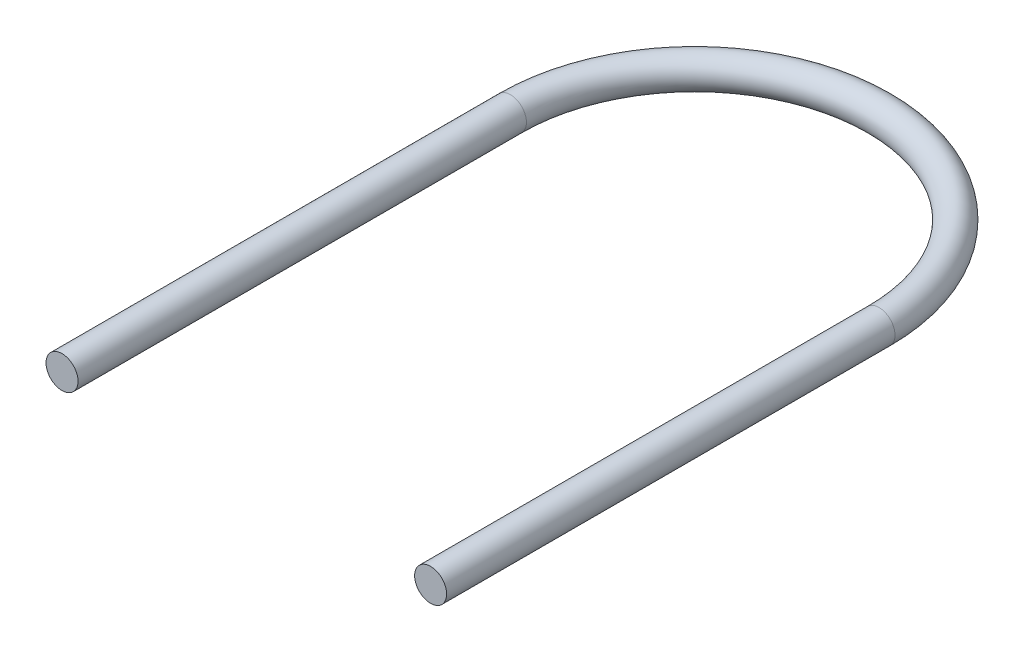
ISO-10303-21;
HEADER;
FILE_DESCRIPTION(('STEP AP214'),'2;1');
FILE_NAME('part.step','',(''),(''),'','','');
FILE_SCHEMA(('AUTOMOTIVE_DESIGN { 1 0 10303 214 1 1 1 1 }'));
ENDSEC;
DATA;
#1=APPLICATION_CONTEXT('core data for automotive mechanical design processes');
#2=APPLICATION_PROTOCOL_DEFINITION('international standard','automotive_design',2000,#1);
#3=PRODUCT_CONTEXT('',#1,'mechanical');
#4=PRODUCT('Part','Part','',(#3));
#5=PRODUCT_RELATED_PRODUCT_CATEGORY('part','',(#4));
#6=PRODUCT_DEFINITION_FORMATION('','',#4);
#7=PRODUCT_DEFINITION_CONTEXT('part definition',#1,'design');
#8=PRODUCT_DEFINITION('design','',#6,#7);
#9=PRODUCT_DEFINITION_SHAPE('','',#8);
#10=(LENGTH_UNIT() NAMED_UNIT(*) SI_UNIT(.MILLI.,.METRE.));
#11=(NAMED_UNIT(*) PLANE_ANGLE_UNIT() SI_UNIT($,.RADIAN.));
#12=(NAMED_UNIT(*) SI_UNIT($,.STERADIAN.) SOLID_ANGLE_UNIT());
#13=UNCERTAINTY_MEASURE_WITH_UNIT(LENGTH_MEASURE(1.E-05),#10,'distance_accuracy_value','');
#14=(GEOMETRIC_REPRESENTATION_CONTEXT(3) GLOBAL_UNCERTAINTY_ASSIGNED_CONTEXT((#13)) GLOBAL_UNIT_ASSIGNED_CONTEXT((#10,
#11,#12)) REPRESENTATION_CONTEXT('',''));
#15=CARTESIAN_POINT('',(0.,0.,0.));
#16=DIRECTION('',(0.,0.,1.));
#17=DIRECTION('',(1.,0.,0.));
#18=AXIS2_PLACEMENT_3D('',#15,#16,#17);
#19=CARTESIAN_POINT('',(-34.7726,0.,84.6074));
#20=DIRECTION('',(0.,0.,-1.));
#21=DIRECTION('',(-1.,0.,0.));
#22=AXIS2_PLACEMENT_3D('',#19,#20,#21);
#23=PLANE('',#22);
#24=CARTESIAN_POINT('',(-34.7726,0.,84.6074));
#25=DIRECTION('',(0.,0.,-1.));
#26=DIRECTION('',(-1.,0.,0.));
#27=AXIS2_PLACEMENT_3D('',#24,#25,#26);
#28=CIRCLE('',#27,3.0226);
#29=CARTESIAN_POINT('',(-37.7952,0.,84.6074));
#30=VERTEX_POINT('',#29);
#31=EDGE_CURVE('E54',#30,#30,#28,.T.);
#32=ORIENTED_EDGE('',*,*,#31,.F.);
#33=EDGE_LOOP('',(#32));
#34=FACE_BOUND('',#33,.T.);
#35=ADVANCED_FACE('F40',(#34),#23,.F.);
#36=CARTESIAN_POINT('',(34.7726,0.,84.6074));
#37=DIRECTION('',(0.,0.,1.));
#38=DIRECTION('',(1.,0.,0.));
#39=AXIS2_PLACEMENT_3D('',#36,#37,#38);
#40=PLANE('',#39);
#41=CARTESIAN_POINT('',(34.7726,0.,84.6074));
#42=DIRECTION('',(0.,0.,1.));
#43=DIRECTION('',(1.,0.,0.));
#44=AXIS2_PLACEMENT_3D('',#41,#42,#43);
#45=CIRCLE('',#44,3.0226);
#46=CARTESIAN_POINT('',(37.7952,0.,84.6074));
#47=VERTEX_POINT('',#46);
#48=EDGE_CURVE('E10',#47,#47,#45,.T.);
#49=ORIENTED_EDGE('',*,*,#48,.T.);
#50=EDGE_LOOP('',(#49));
#51=FACE_BOUND('',#50,.T.);
#52=ADVANCED_FACE('F63',(#51),#40,.T.);
#53=CARTESIAN_POINT('',(-34.7726,0.,84.6074));
#54=DIRECTION('',(0.,0.,-1.));
#55=DIRECTION('',(-1.,0.,0.));
#56=AXIS2_PLACEMENT_3D('',#53,#54,#55);
#57=CYLINDRICAL_SURFACE('',#56,3.0226);
#58=CARTESIAN_POINT('',(-34.7726,0.,0.));
#59=DIRECTION('',(0.,0.,-1.));
#60=DIRECTION('',(-1.,0.,0.));
#61=AXIS2_PLACEMENT_3D('',#58,#59,#60);
#62=CIRCLE('',#61,3.0226);
#63=CARTESIAN_POINT('',(-37.7952,0.,0.));
#64=VERTEX_POINT('',#63);
#65=EDGE_CURVE('E50',#64,#64,#62,.T.);
#66=ORIENTED_EDGE('',*,*,#65,.F.);
#67=EDGE_LOOP('',(#66));
#68=FACE_BOUND('',#67,.T.);
#69=ORIENTED_EDGE('',*,*,#31,.T.);
#70=EDGE_LOOP('',(#69));
#71=FACE_BOUND('',#70,.T.);
#72=ADVANCED_FACE('F60',(#68,#71),#57,.T.);
#73=CARTESIAN_POINT('',(0.,0.,0.));
#74=DIRECTION('',(0.,-1.,0.));
#75=DIRECTION('',(0.,0.,-1.));
#76=AXIS2_PLACEMENT_3D('',#73,#74,#75);
#77=TOROIDAL_SURFACE('',#76,34.7726,3.0226);
#78=CARTESIAN_POINT('',(34.7726,0.,0.));
#79=DIRECTION('',(0.,0.,1.));
#80=DIRECTION('',(1.,0.,0.));
#81=AXIS2_PLACEMENT_3D('',#78,#79,#80);
#82=CIRCLE('',#81,3.0226);
#83=CARTESIAN_POINT('',(37.7952,0.,0.));
#84=VERTEX_POINT('',#83);
#85=EDGE_CURVE('E46',#84,#84,#82,.T.);
#86=CARTESIAN_POINT('',(0.,0.,0.));
#87=DIRECTION('',(0.,-1.,0.));
#88=DIRECTION('',(0.,0.,-1.));
#89=AXIS2_PLACEMENT_3D('',#86,#87,#88);
#90=CIRCLE('',#89,37.7952);
#91=EDGE_CURVE('',#64,#84,#90,.T.);
#92=ORIENTED_EDGE('',*,*,#65,.T.);
#93=ORIENTED_EDGE('',*,*,#85,.F.);
#94=ORIENTED_EDGE('',*,*,#91,.T.);
#95=ORIENTED_EDGE('',*,*,#91,.F.);
#96=EDGE_LOOP('',(#92,#94,#93,#95));
#97=FACE_BOUND('',#96,.T.);
#98=ADVANCED_FACE('F69',(#97),#77,.T.);
#99=CARTESIAN_POINT('',(34.7726,0.,0.));
#100=DIRECTION('',(0.,0.,1.));
#101=DIRECTION('',(1.,0.,0.));
#102=AXIS2_PLACEMENT_3D('',#99,#100,#101);
#103=CYLINDRICAL_SURFACE('',#102,3.0226);
#104=ORIENTED_EDGE('',*,*,#48,.F.);
#105=EDGE_LOOP('',(#104));
#106=FACE_BOUND('',#105,.T.);
#107=ORIENTED_EDGE('',*,*,#85,.T.);
#108=EDGE_LOOP('',(#107));
#109=FACE_BOUND('',#108,.T.);
#110=ADVANCED_FACE('F67',(#106,#109),#103,.T.);
#111=CLOSED_SHELL('',(#35,#52,#72,#98,#110));
#112=MANIFOLD_SOLID_BREP('B2',#111);
#113=ADVANCED_BREP_SHAPE_REPRESENTATION('',(#18,#112),#14);
#114=SHAPE_DEFINITION_REPRESENTATION(#9,#113);
ENDSEC;
END-ISO-10303-21;
